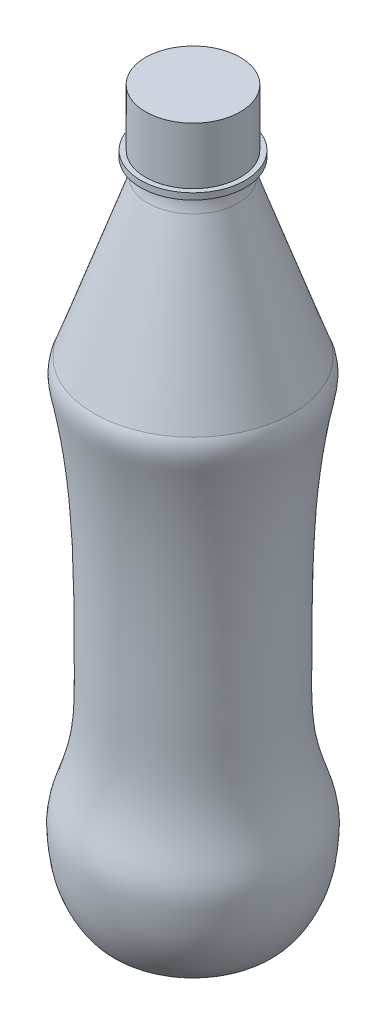
ISO-10303-21;
HEADER;
FILE_DESCRIPTION(('STEP AP214'),'2;1');
FILE_NAME('part.step','',(''),(''),'','','');
FILE_SCHEMA(('AUTOMOTIVE_DESIGN { 1 0 10303 214 1 1 1 1 }'));
ENDSEC;
DATA;
#1=APPLICATION_CONTEXT('core data for automotive mechanical design processes');
#2=APPLICATION_PROTOCOL_DEFINITION('international standard','automotive_design',2000,#1);
#3=PRODUCT_CONTEXT('',#1,'mechanical');
#4=PRODUCT('Part','Part','',(#3));
#5=PRODUCT_RELATED_PRODUCT_CATEGORY('part','',(#4));
#6=PRODUCT_DEFINITION_FORMATION('','',#4);
#7=PRODUCT_DEFINITION_CONTEXT('part definition',#1,'design');
#8=PRODUCT_DEFINITION('design','',#6,#7);
#9=PRODUCT_DEFINITION_SHAPE('','',#8);
#10=(LENGTH_UNIT() NAMED_UNIT(*) SI_UNIT(.MILLI.,.METRE.));
#11=(NAMED_UNIT(*) PLANE_ANGLE_UNIT() SI_UNIT($,.RADIAN.));
#12=(NAMED_UNIT(*) SI_UNIT($,.STERADIAN.) SOLID_ANGLE_UNIT());
#13=UNCERTAINTY_MEASURE_WITH_UNIT(LENGTH_MEASURE(1.E-05),#10,'distance_accuracy_value','');
#14=(GEOMETRIC_REPRESENTATION_CONTEXT(3) GLOBAL_UNCERTAINTY_ASSIGNED_CONTEXT((#13)) GLOBAL_UNIT_ASSIGNED_CONTEXT((#10,
#11,#12)) REPRESENTATION_CONTEXT('',''));
#15=CARTESIAN_POINT('',(0.,0.,0.));
#16=DIRECTION('',(0.,0.,1.));
#17=DIRECTION('',(1.,0.,0.));
#18=AXIS2_PLACEMENT_3D('',#15,#16,#17);
#19=CARTESIAN_POINT('',(0.,-55.3348154703118,0.));
#20=CARTESIAN_POINT('',(1.95633743107819,-55.2690345995404,0.));
#21=CARTESIAN_POINT('',(6.82762255964024,-55.3681525408872,0.));
#22=CARTESIAN_POINT('',(13.0307399679276,-58.7236839421589,0.));
#23=CARTESIAN_POINT('',(22.1679856298383,-63.145599506249,0.));
#24=CARTESIAN_POINT('',(31.0423177348772,-50.9397961112137,0.));
#25=CARTESIAN_POINT('',(32.6953629876471,-40.3545263784495,0.));
#26=CARTESIAN_POINT('',(32.9574023858947,-29.2510251921174,0.));
#27=CARTESIAN_POINT('',(29.7798727616805,-21.167076084638,0.));
#28=CARTESIAN_POINT('',(26.5348788282209,-7.98027780068988,0.));
#29=CARTESIAN_POINT('',(26.823939199196,27.6424462913591,0.));
#30=CARTESIAN_POINT('',(26.5516284620294,62.4338064120912,0.));
#31=CARTESIAN_POINT('',(33.2291264764795,90.8450018167911,0.));
#32=CARTESIAN_POINT('',(31.45,94.2715605564875,0.));
#33=B_SPLINE_CURVE_WITH_KNOTS('',3,(#19,#20,#21,#22,#23,#24,#25,#26,#27,#28,#29,#30,#31,#32),
.UNSPECIFIED.,.F.,.F.,(4,1,1,1,1,1,1,1,1,1,1,4),(0.,0.0312436060409442,0.0794562556704831,
0.117435148316253,0.180297182475338,0.276452030019749,0.303890544582107,0.360729815814347,
0.417162355983541,0.527034667290247,0.942197160091881,1.),.UNSPECIFIED.);
#34=CARTESIAN_POINT('',(0.,168.903192950784,0.));
#35=DIRECTION('',(0.,1.,0.));
#36=AXIS1_PLACEMENT('',#34,#35);
#37=SURFACE_OF_REVOLUTION('',#33,#36);
#38=CARTESIAN_POINT('',(0.,94.2715605564875,0.));
#39=DIRECTION('',(0.,1.,0.));
#40=DIRECTION('',(-1.,0.,0.));
#41=AXIS2_PLACEMENT_3D('',#38,#39,#40);
#42=CIRCLE('',#41,31.45);
#43=CARTESIAN_POINT('',(-31.45,94.2715605564875,0.));
#44=VERTEX_POINT('',#43);
#45=EDGE_CURVE('E11',#44,#44,#42,.T.);
#46=ORIENTED_EDGE('',*,*,#45,.F.);
#47=EDGE_LOOP('',(#46));
#48=FACE_BOUND('',#47,.T.);
#49=CARTESIAN_POINT('',(0.,-55.3348154703118,0.));
#50=VERTEX_POINT('',#49);
#51=VERTEX_LOOP('',#50);
#52=FACE_BOUND('',#51,.T.);
#53=ADVANCED_FACE('F39',(#48,#52),#37,.T.);
#54=CARTESIAN_POINT('',(0.,94.2715605564875,0.));
#55=DIRECTION('',(0.,-1.,0.));
#56=DIRECTION('',(1.,0.,0.));
#57=AXIS2_PLACEMENT_3D('',#54,#55,#56);
#58=CONICAL_SURFACE('',#57,31.45,0.334843590435882);
#59=CARTESIAN_POINT('',(0.,143.497415977262,0.));
#60=DIRECTION('',(0.,1.,0.));
#61=DIRECTION('',(-1.,0.,0.));
#62=AXIS2_PLACEMENT_3D('',#59,#60,#61);
#63=CIRCLE('',#62,14.322072332294);
#64=CARTESIAN_POINT('',(-14.322072332294,143.497415977262,0.));
#65=VERTEX_POINT('',#64);
#66=EDGE_CURVE('E46',#65,#65,#63,.T.);
#67=ORIENTED_EDGE('',*,*,#66,.F.);
#68=EDGE_LOOP('',(#67));
#69=FACE_BOUND('',#68,.T.);
#70=ORIENTED_EDGE('',*,*,#45,.T.);
#71=EDGE_LOOP('',(#70));
#72=FACE_BOUND('',#71,.T.);
#73=ADVANCED_FACE('F50',(#69,#72),#58,.T.);
#74=CARTESIAN_POINT('',(14.322072332294,143.497415977262,0.));
#75=CARTESIAN_POINT('',(13.7085664170603,145.260638829962,0.));
#76=CARTESIAN_POINT('',(13.4345423062956,147.062564487802,0.));
#77=CARTESIAN_POINT('',(13.5,148.903192950784,0.));
#78=B_SPLINE_CURVE_WITH_KNOTS('',3,(#74,#75,#76,#77),.UNSPECIFIED.,.F.,.F.,(4,4),(0.,1.),.UNSPECIFIED.);
#79=CARTESIAN_POINT('',(0.,168.903192950784,0.));
#80=DIRECTION('',(0.,1.,0.));
#81=AXIS1_PLACEMENT('',#79,#80);
#82=SURFACE_OF_REVOLUTION('',#78,#81);
#83=CARTESIAN_POINT('',(0.,148.903192950784,0.));
#84=DIRECTION('',(0.,1.,0.));
#85=DIRECTION('',(-1.,0.,0.));
#86=AXIS2_PLACEMENT_3D('',#83,#84,#85);
#87=CIRCLE('',#86,13.5);
#88=CARTESIAN_POINT('',(-13.5,148.903192950784,0.));
#89=VERTEX_POINT('',#88);
#90=EDGE_CURVE('E91',#89,#89,#87,.T.);
#91=ORIENTED_EDGE('',*,*,#90,.F.);
#92=EDGE_LOOP('',(#91));
#93=FACE_BOUND('',#92,.T.);
#94=ORIENTED_EDGE('',*,*,#66,.T.);
#95=EDGE_LOOP('',(#94));
#96=FACE_BOUND('',#95,.T.);
#97=ADVANCED_FACE('F55',(#93,#96),#82,.T.);
#98=CARTESIAN_POINT('',(16.6,148.903192950784,0.));
#99=DIRECTION('',(0.,1.,0.));
#100=DIRECTION('',(-1.,0.,0.));
#101=AXIS2_PLACEMENT_3D('',#98,#99,#100);
#102=PLANE('',#101);
#103=CARTESIAN_POINT('',(0.,148.903192950784,0.));
#104=DIRECTION('',(0.,1.,0.));
#105=DIRECTION('',(-1.,0.,0.));
#106=AXIS2_PLACEMENT_3D('',#103,#104,#105);
#107=CIRCLE('',#106,16.6);
#108=CARTESIAN_POINT('',(-16.6,148.903192950784,0.));
#109=VERTEX_POINT('',#108);
#110=EDGE_CURVE('E88',#109,#109,#107,.T.);
#111=ORIENTED_EDGE('',*,*,#110,.F.);
#112=EDGE_LOOP('',(#111));
#113=FACE_BOUND('',#112,.T.);
#114=ORIENTED_EDGE('',*,*,#90,.T.);
#115=EDGE_LOOP('',(#114));
#116=FACE_BOUND('',#115,.T.);
#117=ADVANCED_FACE('F62',(#113,#116),#102,.F.);
#118=CARTESIAN_POINT('',(0.,168.903192950784,0.));
#119=DIRECTION('',(0.,1.,0.));
#120=DIRECTION('',(-1.,0.,0.));
#121=AXIS2_PLACEMENT_3D('',#118,#119,#120);
#122=CYLINDRICAL_SURFACE('',#121,16.6);
#123=CARTESIAN_POINT('',(0.,150.903192950784,0.));
#124=DIRECTION('',(0.,1.,0.));
#125=DIRECTION('',(-1.,0.,0.));
#126=AXIS2_PLACEMENT_3D('',#123,#124,#125);
#127=CIRCLE('',#126,16.6);
#128=CARTESIAN_POINT('',(-16.6,150.903192950784,0.));
#129=VERTEX_POINT('',#128);
#130=EDGE_CURVE('E85',#129,#129,#127,.T.);
#131=ORIENTED_EDGE('',*,*,#130,.F.);
#132=EDGE_LOOP('',(#131));
#133=FACE_BOUND('',#132,.T.);
#134=ORIENTED_EDGE('',*,*,#110,.T.);
#135=EDGE_LOOP('',(#134));
#136=FACE_BOUND('',#135,.T.);
#137=ADVANCED_FACE('F98',(#133,#136),#122,.T.);
#138=CARTESIAN_POINT('',(15.,150.903192950784,0.));
#139=DIRECTION('',(0.,-1.,0.));
#140=DIRECTION('',(1.,0.,0.));
#141=AXIS2_PLACEMENT_3D('',#138,#139,#140);
#142=PLANE('',#141);
#143=CARTESIAN_POINT('',(0.,150.903192950784,0.));
#144=DIRECTION('',(0.,1.,0.));
#145=DIRECTION('',(-1.,0.,0.));
#146=AXIS2_PLACEMENT_3D('',#143,#144,#145);
#147=CIRCLE('',#146,15.);
#148=CARTESIAN_POINT('',(-15.,150.903192950784,0.));
#149=VERTEX_POINT('',#148);
#150=EDGE_CURVE('E82',#149,#149,#147,.T.);
#151=ORIENTED_EDGE('',*,*,#150,.F.);
#152=EDGE_LOOP('',(#151));
#153=FACE_BOUND('',#152,.T.);
#154=ORIENTED_EDGE('',*,*,#130,.T.);
#155=EDGE_LOOP('',(#154));
#156=FACE_BOUND('',#155,.T.);
#157=ADVANCED_FACE('F103',(#153,#156),#142,.F.);
#158=CARTESIAN_POINT('',(0.,168.903192950784,0.));
#159=DIRECTION('',(0.,1.,0.));
#160=DIRECTION('',(-1.,0.,0.));
#161=AXIS2_PLACEMENT_3D('',#158,#159,#160);
#162=CYLINDRICAL_SURFACE('',#161,15.);
#163=CARTESIAN_POINT('',(0.,168.903192950784,0.));
#164=DIRECTION('',(0.,1.,0.));
#165=DIRECTION('',(-1.,0.,0.));
#166=AXIS2_PLACEMENT_3D('',#163,#164,#165);
#167=CIRCLE('',#166,15.);
#168=CARTESIAN_POINT('',(-15.,168.903192950784,0.));
#169=VERTEX_POINT('',#168);
#170=EDGE_CURVE('E76',#169,#169,#167,.T.);
#171=ORIENTED_EDGE('',*,*,#170,.F.);
#172=EDGE_LOOP('',(#171));
#173=FACE_BOUND('',#172,.T.);
#174=ORIENTED_EDGE('',*,*,#150,.T.);
#175=EDGE_LOOP('',(#174));
#176=FACE_BOUND('',#175,.T.);
#177=ADVANCED_FACE('F110',(#173,#176),#162,.T.);
#178=CARTESIAN_POINT('',(0.,168.903192950784,0.));
#179=DIRECTION('',(0.,-1.,0.));
#180=DIRECTION('',(1.,0.,0.));
#181=AXIS2_PLACEMENT_3D('',#178,#179,#180);
#182=PLANE('',#181);
#183=ORIENTED_EDGE('',*,*,#170,.T.);
#184=EDGE_LOOP('',(#183));
#185=FACE_BOUND('',#184,.T.);
#186=ADVANCED_FACE('F117',(#185),#182,.F.);
#187=CLOSED_SHELL('',(#53,#73,#97,#117,#137,#157,#177,#186));
#188=MANIFOLD_SOLID_BREP('B2',#187);
#189=ADVANCED_BREP_SHAPE_REPRESENTATION('',(#18,#188),#14);
#190=SHAPE_DEFINITION_REPRESENTATION(#9,#189);
ENDSEC;
END-ISO-10303-21;
